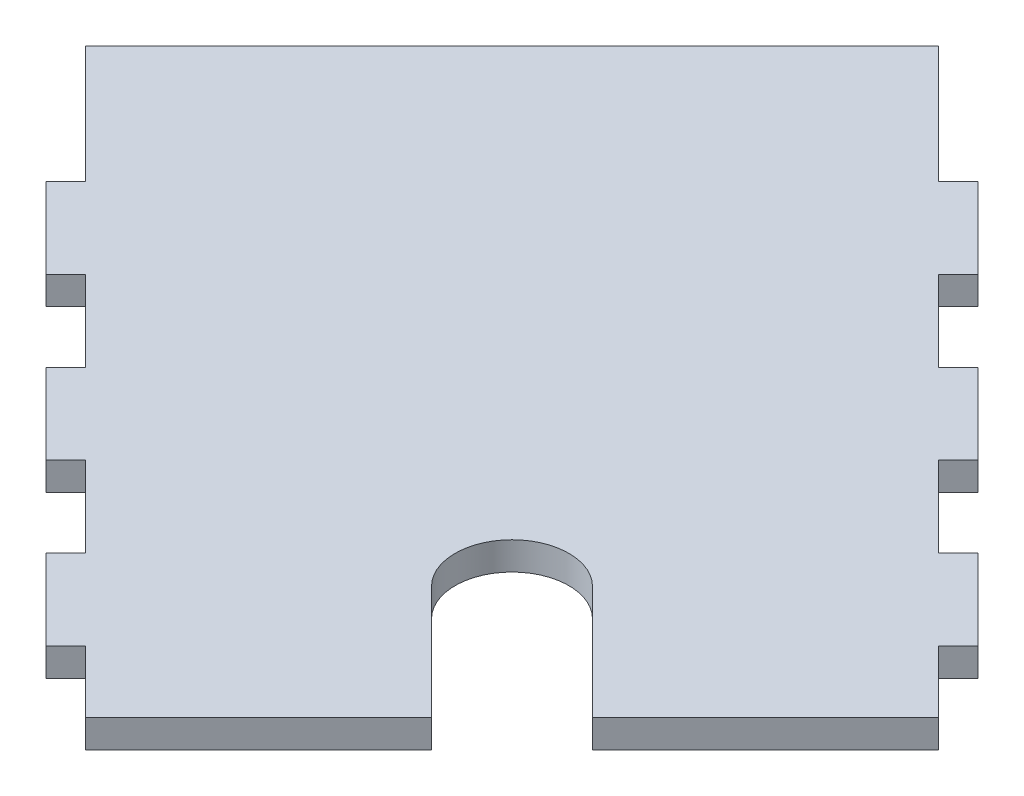
ISO-10303-21;
HEADER;
FILE_DESCRIPTION(('STEP AP214'),'2;1');
FILE_NAME('part.step','',(''),(''),'','','');
FILE_SCHEMA(('AUTOMOTIVE_DESIGN { 1 0 10303 214 1 1 1 1 }'));
ENDSEC;
DATA;
#1=APPLICATION_CONTEXT('core data for automotive mechanical design processes');
#2=APPLICATION_PROTOCOL_DEFINITION('international standard','automotive_design',2000,#1);
#3=PRODUCT_CONTEXT('',#1,'mechanical');
#4=PRODUCT('Part','Part','',(#3));
#5=PRODUCT_RELATED_PRODUCT_CATEGORY('part','',(#4));
#6=PRODUCT_DEFINITION_FORMATION('','',#4);
#7=PRODUCT_DEFINITION_CONTEXT('part definition',#1,'design');
#8=PRODUCT_DEFINITION('design','',#6,#7);
#9=PRODUCT_DEFINITION_SHAPE('','',#8);
#10=(LENGTH_UNIT() NAMED_UNIT(*) SI_UNIT(.MILLI.,.METRE.));
#11=(NAMED_UNIT(*) PLANE_ANGLE_UNIT() SI_UNIT($,.RADIAN.));
#12=(NAMED_UNIT(*) SI_UNIT($,.STERADIAN.) SOLID_ANGLE_UNIT());
#13=UNCERTAINTY_MEASURE_WITH_UNIT(LENGTH_MEASURE(1.E-05),#10,'distance_accuracy_value','');
#14=(GEOMETRIC_REPRESENTATION_CONTEXT(3) GLOBAL_UNCERTAINTY_ASSIGNED_CONTEXT((#13)) GLOBAL_UNIT_ASSIGNED_CONTEXT((#10,
#11,#12)) REPRESENTATION_CONTEXT('',''));
#15=CARTESIAN_POINT('',(0.,0.,0.));
#16=DIRECTION('',(0.,0.,1.));
#17=DIRECTION('',(1.,0.,0.));
#18=AXIS2_PLACEMENT_3D('',#15,#16,#17);
#19=CARTESIAN_POINT('',(146.127242634634,3.1242,-55.7134960817103));
#20=DIRECTION('',(-0.707106781186548,0.,0.707106781186548));
#21=DIRECTION('',(0.707106781186548,0.,0.707106781186548));
#22=AXIS2_PLACEMENT_3D('',#19,#20,#21);
#23=PLANE('',#22);
#24=DIRECTION('',(-0.707106781186547,0.,-0.707106781186547));
#25=VECTOR('',#24,1.);
#26=CARTESIAN_POINT('',(146.127242634634,0.,-55.7134960817103));
#27=LINE('',#26,#25);
#28=CARTESIAN_POINT('',(146.127242634634,0.,-55.7134960817103));
#29=VERTEX_POINT('',#28);
#30=CARTESIAN_POINT('',(139.212445421411,0.,-62.6282932949331));
#31=VERTEX_POINT('',#30);
#32=EDGE_CURVE('E273',#29,#31,#27,.T.);
#33=ORIENTED_EDGE('',*,*,#32,.T.);
#34=DIRECTION('',(0.,-1.,0.));
#35=VECTOR('',#34,1.);
#36=CARTESIAN_POINT('',(139.212445421411,3.1242,-62.6282932949331));
#37=LINE('',#36,#35);
#38=CARTESIAN_POINT('',(139.212445421411,3.1242,-62.6282932949331));
#39=VERTEX_POINT('',#38);
#40=EDGE_CURVE('E11',#39,#31,#37,.T.);
#41=ORIENTED_EDGE('',*,*,#40,.F.);
#42=DIRECTION('',(-0.707106781186547,0.,-0.707106781186547));
#43=VECTOR('',#42,1.);
#44=CARTESIAN_POINT('',(146.127242634634,3.1242,-55.7134960817103));
#45=LINE('',#44,#43);
#46=CARTESIAN_POINT('',(146.127242634634,3.1242,-55.7134960817103));
#47=VERTEX_POINT('',#46);
#48=EDGE_CURVE('E335',#47,#39,#45,.T.);
#49=ORIENTED_EDGE('',*,*,#48,.F.);
#50=DIRECTION('',(0.,-1.,0.));
#51=VECTOR('',#50,1.);
#52=CARTESIAN_POINT('',(146.127242634634,3.1242,-55.7134960817103));
#53=LINE('',#52,#51);
#54=EDGE_CURVE('E269',#47,#29,#53,.T.);
#55=ORIENTED_EDGE('',*,*,#54,.T.);
#56=EDGE_LOOP('',(#33,#41,#49,#55));
#57=FACE_BOUND('',#56,.T.);
#58=ADVANCED_FACE('F33',(#57),#23,.F.);
#59=CARTESIAN_POINT('',(139.212445421411,3.1242,-62.6282932949331));
#60=DIRECTION('',(-0.70710678118655,0.,-0.707106781186545));
#61=DIRECTION('',(-0.707106781186545,0.,0.70710678118655));
#62=AXIS2_PLACEMENT_3D('',#59,#60,#61);
#63=PLANE('',#62);
#64=DIRECTION('',(0.707106781186545,0.,-0.70710678118655));
#65=VECTOR('',#64,1.);
#66=CARTESIAN_POINT('',(139.212445421411,0.,-62.6282932949331));
#67=LINE('',#66,#65);
#68=CARTESIAN_POINT('',(141.421588427194,0.,-64.8374363007162));
#69=VERTEX_POINT('',#68);
#70=EDGE_CURVE('E276',#31,#69,#67,.T.);
#71=ORIENTED_EDGE('',*,*,#70,.T.);
#72=DIRECTION('',(0.,-1.,0.));
#73=VECTOR('',#72,1.);
#74=CARTESIAN_POINT('',(141.421588427194,3.1242,-64.8374363007162));
#75=LINE('',#74,#73);
#76=CARTESIAN_POINT('',(141.421588427194,3.1242,-64.8374363007162));
#77=VERTEX_POINT('',#76);
#78=EDGE_CURVE('E41',#77,#69,#75,.T.);
#79=ORIENTED_EDGE('',*,*,#78,.F.);
#80=DIRECTION('',(0.707106781186545,0.,-0.70710678118655));
#81=VECTOR('',#80,1.);
#82=CARTESIAN_POINT('',(139.212445421411,3.1242,-62.6282932949331));
#83=LINE('',#82,#81);
#84=EDGE_CURVE('E164',#39,#77,#83,.T.);
#85=ORIENTED_EDGE('',*,*,#84,.F.);
#86=ORIENTED_EDGE('',*,*,#40,.T.);
#87=EDGE_LOOP('',(#71,#79,#85,#86));
#88=FACE_BOUND('',#87,.T.);
#89=ADVANCED_FACE('F513',(#88),#63,.F.);
#90=CARTESIAN_POINT('',(141.421588427194,3.1242,-64.8374363007162));
#91=DIRECTION('',(-0.707106781186548,0.,0.707106781186548));
#92=DIRECTION('',(0.707106781186548,0.,0.707106781186548));
#93=AXIS2_PLACEMENT_3D('',#90,#91,#92);
#94=PLANE('',#93);
#95=DIRECTION('',(-0.707106781186547,0.,-0.707106781186547));
#96=VECTOR('',#95,1.);
#97=CARTESIAN_POINT('',(141.421588427194,0.,-64.8374363007162));
#98=LINE('',#97,#96);
#99=CARTESIAN_POINT('',(132.441332306125,0.,-73.8176924217853));
#100=VERTEX_POINT('',#99);
#101=EDGE_CURVE('E278',#69,#100,#98,.T.);
#102=ORIENTED_EDGE('',*,*,#101,.T.);
#103=DIRECTION('',(0.,-1.,0.));
#104=VECTOR('',#103,1.);
#105=CARTESIAN_POINT('',(132.441332306125,3.1242,-73.8176924217853));
#106=LINE('',#105,#104);
#107=CARTESIAN_POINT('',(132.441332306125,3.1242,-73.8176924217853));
#108=VERTEX_POINT('',#107);
#109=EDGE_CURVE('E414',#108,#100,#106,.T.);
#110=ORIENTED_EDGE('',*,*,#109,.F.);
#111=DIRECTION('',(-0.707106781186547,0.,-0.707106781186547));
#112=VECTOR('',#111,1.);
#113=CARTESIAN_POINT('',(141.421588427194,3.1242,-64.8374363007162));
#114=LINE('',#113,#112);
#115=EDGE_CURVE('E422',#77,#108,#114,.T.);
#116=ORIENTED_EDGE('',*,*,#115,.F.);
#117=ORIENTED_EDGE('',*,*,#78,.T.);
#118=EDGE_LOOP('',(#102,#110,#116,#117));
#119=FACE_BOUND('',#118,.T.);
#120=ADVANCED_FACE('F420',(#119),#94,.F.);
#121=CARTESIAN_POINT('',(132.441332306125,3.1242,-73.8176924217853));
#122=DIRECTION('',(0.707106781186548,0.,0.707106781186548));
#123=DIRECTION('',(0.707106781186548,0.,-0.707106781186548));
#124=AXIS2_PLACEMENT_3D('',#121,#122,#123);
#125=PLANE('',#124);
#126=DIRECTION('',(-0.707106781186547,0.,0.707106781186547));
#127=VECTOR('',#126,1.);
#128=CARTESIAN_POINT('',(132.441332306125,0.,-73.8176924217853));
#129=LINE('',#128,#127);
#130=CARTESIAN_POINT('',(130.232189300342,0.,-71.6085494160023));
#131=VERTEX_POINT('',#130);
#132=EDGE_CURVE('E280',#100,#131,#129,.T.);
#133=ORIENTED_EDGE('',*,*,#132,.T.);
#134=DIRECTION('',(0.,-1.,0.));
#135=VECTOR('',#134,1.);
#136=CARTESIAN_POINT('',(130.232189300342,3.1242,-71.6085494160023));
#137=LINE('',#136,#135);
#138=CARTESIAN_POINT('',(130.232189300342,3.1242,-71.6085494160023));
#139=VERTEX_POINT('',#138);
#140=EDGE_CURVE('E411',#139,#131,#137,.T.);
#141=ORIENTED_EDGE('',*,*,#140,.F.);
#142=DIRECTION('',(-0.707106781186547,0.,0.707106781186547));
#143=VECTOR('',#142,1.);
#144=CARTESIAN_POINT('',(132.441332306125,3.1242,-73.8176924217853));
#145=LINE('',#144,#143);
#146=EDGE_CURVE('E440',#108,#139,#145,.T.);
#147=ORIENTED_EDGE('',*,*,#146,.F.);
#148=ORIENTED_EDGE('',*,*,#109,.T.);
#149=EDGE_LOOP('',(#133,#141,#147,#148));
#150=FACE_BOUND('',#149,.T.);
#151=ADVANCED_FACE('F431',(#150),#125,.F.);
#152=CARTESIAN_POINT('',(130.232189300342,3.1242,-71.6085494160023));
#153=DIRECTION('',(-0.707106781186549,0.,0.707106781186546));
#154=DIRECTION('',(0.707106781186546,0.,0.707106781186549));
#155=AXIS2_PLACEMENT_3D('',#152,#153,#154);
#156=PLANE('',#155);
#157=DIRECTION('',(-0.707106781186546,0.,-0.707106781186549));
#158=VECTOR('',#157,1.);
#159=CARTESIAN_POINT('',(130.232189300342,0.,-71.6085494160023));
#160=LINE('',#159,#158);
#161=CARTESIAN_POINT('',(121.251933179273,0.,-80.5888055370715));
#162=VERTEX_POINT('',#161);
#163=EDGE_CURVE('E282',#131,#162,#160,.T.);
#164=ORIENTED_EDGE('',*,*,#163,.T.);
#165=DIRECTION('',(0.,-1.,0.));
#166=VECTOR('',#165,1.);
#167=CARTESIAN_POINT('',(121.251933179273,3.1242,-80.5888055370715));
#168=LINE('',#167,#166);
#169=CARTESIAN_POINT('',(121.251933179273,3.1242,-80.5888055370715));
#170=VERTEX_POINT('',#169);
#171=EDGE_CURVE('E408',#170,#162,#168,.T.);
#172=ORIENTED_EDGE('',*,*,#171,.F.);
#173=DIRECTION('',(-0.707106781186546,0.,-0.707106781186549));
#174=VECTOR('',#173,1.);
#175=CARTESIAN_POINT('',(130.232189300342,3.1242,-71.6085494160023));
#176=LINE('',#175,#174);
#177=EDGE_CURVE('E437',#139,#170,#176,.T.);
#178=ORIENTED_EDGE('',*,*,#177,.F.);
#179=ORIENTED_EDGE('',*,*,#140,.T.);
#180=EDGE_LOOP('',(#164,#172,#178,#179));
#181=FACE_BOUND('',#180,.T.);
#182=ADVANCED_FACE('F435',(#181),#156,.F.);
#183=CARTESIAN_POINT('',(121.251933179273,3.1242,-80.5888055370715));
#184=DIRECTION('',(-0.707106781186552,0.,-0.707106781186543));
#185=DIRECTION('',(-0.707106781186543,0.,0.707106781186552));
#186=AXIS2_PLACEMENT_3D('',#183,#184,#185);
#187=PLANE('',#186);
#188=DIRECTION('',(0.707106781186543,0.,-0.707106781186552));
#189=VECTOR('',#188,1.);
#190=CARTESIAN_POINT('',(121.251933179273,0.,-80.5888055370715));
#191=LINE('',#190,#189);
#192=CARTESIAN_POINT('',(123.461076185056,0.,-82.7979485428545));
#193=VERTEX_POINT('',#192);
#194=EDGE_CURVE('E284',#162,#193,#191,.T.);
#195=ORIENTED_EDGE('',*,*,#194,.T.);
#196=DIRECTION('',(0.,-1.,0.));
#197=VECTOR('',#196,1.);
#198=CARTESIAN_POINT('',(123.461076185056,3.1242,-82.7979485428545));
#199=LINE('',#198,#197);
#200=CARTESIAN_POINT('',(123.461076185056,3.1242,-82.7979485428545));
#201=VERTEX_POINT('',#200);
#202=EDGE_CURVE('E405',#201,#193,#199,.T.);
#203=ORIENTED_EDGE('',*,*,#202,.F.);
#204=DIRECTION('',(0.707106781186543,0.,-0.707106781186552));
#205=VECTOR('',#204,1.);
#206=CARTESIAN_POINT('',(121.251933179273,3.1242,-80.5888055370715));
#207=LINE('',#206,#205);
#208=EDGE_CURVE('E439',#170,#201,#207,.T.);
#209=ORIENTED_EDGE('',*,*,#208,.F.);
#210=ORIENTED_EDGE('',*,*,#171,.T.);
#211=EDGE_LOOP('',(#195,#203,#209,#210));
#212=FACE_BOUND('',#211,.T.);
#213=ADVANCED_FACE('F526',(#212),#187,.F.);
#214=CARTESIAN_POINT('',(123.461076185056,3.1242,-82.7979485428545));
#215=DIRECTION('',(-0.707106781186548,0.,0.707106781186548));
#216=DIRECTION('',(0.707106781186548,0.,0.707106781186548));
#217=AXIS2_PLACEMENT_3D('',#214,#215,#216);
#218=PLANE('',#217);
#219=DIRECTION('',(-0.707106781186547,0.,-0.707106781186547));
#220=VECTOR('',#219,1.);
#221=CARTESIAN_POINT('',(123.461076185056,0.,-82.7979485428545));
#222=LINE('',#221,#220);
#223=CARTESIAN_POINT('',(114.480820063987,0.,-91.7782046639236));
#224=VERTEX_POINT('',#223);
#225=EDGE_CURVE('E286',#193,#224,#222,.T.);
#226=ORIENTED_EDGE('',*,*,#225,.T.);
#227=DIRECTION('',(0.,-1.,0.));
#228=VECTOR('',#227,1.);
#229=CARTESIAN_POINT('',(114.480820063987,3.1242,-91.7782046639236));
#230=LINE('',#229,#228);
#231=CARTESIAN_POINT('',(114.480820063987,3.1242,-91.7782046639236));
#232=VERTEX_POINT('',#231);
#233=EDGE_CURVE('E402',#232,#224,#230,.T.);
#234=ORIENTED_EDGE('',*,*,#233,.F.);
#235=DIRECTION('',(-0.707106781186547,0.,-0.707106781186547));
#236=VECTOR('',#235,1.);
#237=CARTESIAN_POINT('',(123.461076185056,3.1242,-82.7979485428545));
#238=LINE('',#237,#236);
#239=EDGE_CURVE('E442',#201,#232,#238,.T.);
#240=ORIENTED_EDGE('',*,*,#239,.F.);
#241=ORIENTED_EDGE('',*,*,#202,.T.);
#242=EDGE_LOOP('',(#226,#234,#240,#241));
#243=FACE_BOUND('',#242,.T.);
#244=ADVANCED_FACE('F529',(#243),#218,.F.);
#245=CARTESIAN_POINT('',(114.480820063987,3.1242,-91.7782046639236));
#246=DIRECTION('',(0.707106781186548,0.,0.707106781186548));
#247=DIRECTION('',(0.707106781186548,0.,-0.707106781186548));
#248=AXIS2_PLACEMENT_3D('',#245,#246,#247);
#249=PLANE('',#248);
#250=DIRECTION('',(-0.707106781186547,0.,0.707106781186547));
#251=VECTOR('',#250,1.);
#252=CARTESIAN_POINT('',(114.480820063987,0.,-91.7782046639236));
#253=LINE('',#252,#251);
#254=CARTESIAN_POINT('',(112.271677058204,0.,-89.5690616581406));
#255=VERTEX_POINT('',#254);
#256=EDGE_CURVE('E288',#224,#255,#253,.T.);
#257=ORIENTED_EDGE('',*,*,#256,.T.);
#258=DIRECTION('',(0.,-1.,0.));
#259=VECTOR('',#258,1.);
#260=CARTESIAN_POINT('',(112.271677058204,3.1242,-89.5690616581406));
#261=LINE('',#260,#259);
#262=CARTESIAN_POINT('',(112.271677058204,3.1242,-89.5690616581406));
#263=VERTEX_POINT('',#262);
#264=EDGE_CURVE('E399',#263,#255,#261,.T.);
#265=ORIENTED_EDGE('',*,*,#264,.F.);
#266=DIRECTION('',(-0.707106781186547,0.,0.707106781186547));
#267=VECTOR('',#266,1.);
#268=CARTESIAN_POINT('',(114.480820063987,3.1242,-91.7782046639236));
#269=LINE('',#268,#267);
#270=EDGE_CURVE('E448',#232,#263,#269,.T.);
#271=ORIENTED_EDGE('',*,*,#270,.F.);
#272=ORIENTED_EDGE('',*,*,#233,.T.);
#273=EDGE_LOOP('',(#257,#265,#271,#272));
#274=FACE_BOUND('',#273,.T.);
#275=ADVANCED_FACE('F533',(#274),#249,.F.);
#276=CARTESIAN_POINT('',(112.271677058204,3.1242,-89.5690616581406));
#277=DIRECTION('',(-0.707106781186549,0.,0.707106781186546));
#278=DIRECTION('',(0.707106781186546,0.,0.707106781186549));
#279=AXIS2_PLACEMENT_3D('',#276,#277,#278);
#280=PLANE('',#279);
#281=DIRECTION('',(-0.707106781186546,0.,-0.707106781186549));
#282=VECTOR('',#281,1.);
#283=CARTESIAN_POINT('',(112.271677058204,0.,-89.5690616581406));
#284=LINE('',#283,#282);
#285=CARTESIAN_POINT('',(103.291420937135,0.,-98.5493177792098));
#286=VERTEX_POINT('',#285);
#287=EDGE_CURVE('E290',#255,#286,#284,.T.);
#288=ORIENTED_EDGE('',*,*,#287,.T.);
#289=DIRECTION('',(0.,-1.,0.));
#290=VECTOR('',#289,1.);
#291=CARTESIAN_POINT('',(103.291420937135,3.1242,-98.5493177792098));
#292=LINE('',#291,#290);
#293=CARTESIAN_POINT('',(103.291420937135,3.1242,-98.5493177792098));
#294=VERTEX_POINT('',#293);
#295=EDGE_CURVE('E396',#294,#286,#292,.T.);
#296=ORIENTED_EDGE('',*,*,#295,.F.);
#297=DIRECTION('',(-0.707106781186546,0.,-0.707106781186549));
#298=VECTOR('',#297,1.);
#299=CARTESIAN_POINT('',(112.271677058204,3.1242,-89.5690616581406));
#300=LINE('',#299,#298);
#301=EDGE_CURVE('E450',#263,#294,#300,.T.);
#302=ORIENTED_EDGE('',*,*,#301,.F.);
#303=ORIENTED_EDGE('',*,*,#264,.T.);
#304=EDGE_LOOP('',(#288,#296,#302,#303));
#305=FACE_BOUND('',#304,.T.);
#306=ADVANCED_FACE('F537',(#305),#280,.F.);
#307=CARTESIAN_POINT('',(103.291420937135,3.1242,-98.5493177792098));
#308=DIRECTION('',(-0.70710678118655,0.,-0.707106781186545));
#309=DIRECTION('',(-0.707106781186545,0.,0.70710678118655));
#310=AXIS2_PLACEMENT_3D('',#307,#308,#309);
#311=PLANE('',#310);
#312=DIRECTION('',(0.707106781186545,0.,-0.70710678118655));
#313=VECTOR('',#312,1.);
#314=CARTESIAN_POINT('',(103.291420937135,0.,-98.5493177792098));
#315=LINE('',#314,#313);
#316=CARTESIAN_POINT('',(105.500563942918,0.,-100.758460784993));
#317=VERTEX_POINT('',#316);
#318=EDGE_CURVE('E292',#286,#317,#315,.T.);
#319=ORIENTED_EDGE('',*,*,#318,.T.);
#320=DIRECTION('',(0.,-1.,0.));
#321=VECTOR('',#320,1.);
#322=CARTESIAN_POINT('',(105.500563942918,3.1242,-100.758460784993));
#323=LINE('',#322,#321);
#324=CARTESIAN_POINT('',(105.500563942918,3.1242,-100.758460784993));
#325=VERTEX_POINT('',#324);
#326=EDGE_CURVE('E393',#325,#317,#323,.T.);
#327=ORIENTED_EDGE('',*,*,#326,.F.);
#328=DIRECTION('',(0.707106781186545,0.,-0.70710678118655));
#329=VECTOR('',#328,1.);
#330=CARTESIAN_POINT('',(103.291420937135,3.1242,-98.5493177792098));
#331=LINE('',#330,#329);
#332=EDGE_CURVE('E452',#294,#325,#331,.T.);
#333=ORIENTED_EDGE('',*,*,#332,.F.);
#334=ORIENTED_EDGE('',*,*,#295,.T.);
#335=EDGE_LOOP('',(#319,#327,#333,#334));
#336=FACE_BOUND('',#335,.T.);
#337=ADVANCED_FACE('F541',(#336),#311,.F.);
#338=CARTESIAN_POINT('',(105.500563942918,3.1242,-100.758460784993));
#339=DIRECTION('',(-0.707106781186548,0.,0.707106781186548));
#340=DIRECTION('',(0.707106781186548,0.,0.707106781186548));
#341=AXIS2_PLACEMENT_3D('',#338,#339,#340);
#342=PLANE('',#341);
#343=DIRECTION('',(-0.707106781186547,0.,-0.707106781186547));
#344=VECTOR('',#343,1.);
#345=CARTESIAN_POINT('',(105.500563942918,0.,-100.758460784993));
#346=LINE('',#345,#344);
#347=CARTESIAN_POINT('',(96.5203078218484,0.,-109.738716906062));
#348=VERTEX_POINT('',#347);
#349=EDGE_CURVE('E294',#317,#348,#346,.T.);
#350=ORIENTED_EDGE('',*,*,#349,.T.);
#351=DIRECTION('',(0.,-1.,0.));
#352=VECTOR('',#351,1.);
#353=CARTESIAN_POINT('',(96.5203078218484,3.1242,-109.738716906062));
#354=LINE('',#353,#352);
#355=CARTESIAN_POINT('',(96.5203078218484,3.1242,-109.738716906062));
#356=VERTEX_POINT('',#355);
#357=EDGE_CURVE('E390',#356,#348,#354,.T.);
#358=ORIENTED_EDGE('',*,*,#357,.F.);
#359=DIRECTION('',(-0.707106781186547,0.,-0.707106781186547));
#360=VECTOR('',#359,1.);
#361=CARTESIAN_POINT('',(105.500563942918,3.1242,-100.758460784993));
#362=LINE('',#361,#360);
#363=EDGE_CURVE('E454',#325,#356,#362,.T.);
#364=ORIENTED_EDGE('',*,*,#363,.F.);
#365=ORIENTED_EDGE('',*,*,#326,.T.);
#366=EDGE_LOOP('',(#350,#358,#364,#365));
#367=FACE_BOUND('',#366,.T.);
#368=ADVANCED_FACE('F545',(#367),#342,.F.);
#369=CARTESIAN_POINT('',(96.5203078218484,3.1242,-109.738716906062));
#370=DIRECTION('',(0.707106781186547,0.,0.707106781186547));
#371=DIRECTION('',(0.707106781186548,0.,-0.707106781186548));
#372=AXIS2_PLACEMENT_3D('',#369,#370,#371);
#373=PLANE('',#372);
#374=DIRECTION('',(-0.707106781186548,0.,0.707106781186548));
#375=VECTOR('',#374,1.);
#376=CARTESIAN_POINT('',(96.5203078218484,0.,-109.738716906062));
#377=LINE('',#376,#375);
#378=CARTESIAN_POINT('',(94.3111648160654,0.,-107.529573900279));
#379=VERTEX_POINT('',#378);
#380=EDGE_CURVE('E296',#348,#379,#377,.T.);
#381=ORIENTED_EDGE('',*,*,#380,.T.);
#382=DIRECTION('',(0.,-1.,0.));
#383=VECTOR('',#382,1.);
#384=CARTESIAN_POINT('',(94.3111648160654,3.1242,-107.529573900279));
#385=LINE('',#384,#383);
#386=CARTESIAN_POINT('',(94.3111648160654,3.1242,-107.529573900279));
#387=VERTEX_POINT('',#386);
#388=EDGE_CURVE('E387',#387,#379,#385,.T.);
#389=ORIENTED_EDGE('',*,*,#388,.F.);
#390=DIRECTION('',(-0.707106781186548,0.,0.707106781186548));
#391=VECTOR('',#390,1.);
#392=CARTESIAN_POINT('',(96.5203078218484,3.1242,-109.738716906062));
#393=LINE('',#392,#391);
#394=EDGE_CURVE('E456',#356,#387,#393,.T.);
#395=ORIENTED_EDGE('',*,*,#394,.F.);
#396=ORIENTED_EDGE('',*,*,#357,.T.);
#397=EDGE_LOOP('',(#381,#389,#395,#396));
#398=FACE_BOUND('',#397,.T.);
#399=ADVANCED_FACE('F549',(#398),#373,.F.);
#400=CARTESIAN_POINT('',(94.3111648160654,3.1242,-107.529573900279));
#401=DIRECTION('',(-0.707106781186547,0.,0.707106781186548));
#402=DIRECTION('',(0.707106781186548,0.,0.707106781186547));
#403=AXIS2_PLACEMENT_3D('',#400,#401,#402);
#404=PLANE('',#403);
#405=DIRECTION('',(-0.707106781186548,0.,-0.707106781186547));
#406=VECTOR('',#405,1.);
#407=CARTESIAN_POINT('',(94.3111648160654,0.,-107.529573900279));
#408=LINE('',#407,#406);
#409=CARTESIAN_POINT('',(81.2250949148757,0.,-120.615643801469));
#410=VERTEX_POINT('',#409);
#411=EDGE_CURVE('E298',#379,#410,#408,.T.);
#412=ORIENTED_EDGE('',*,*,#411,.T.);
#413=DIRECTION('',(0.,-1.,0.));
#414=VECTOR('',#413,1.);
#415=CARTESIAN_POINT('',(81.2250949148757,3.1242,-120.615643801469));
#416=LINE('',#415,#414);
#417=CARTESIAN_POINT('',(81.2250949148757,3.1242,-120.615643801469));
#418=VERTEX_POINT('',#417);
#419=EDGE_CURVE('E384',#418,#410,#416,.T.);
#420=ORIENTED_EDGE('',*,*,#419,.F.);
#421=DIRECTION('',(-0.707106781186548,0.,-0.707106781186547));
#422=VECTOR('',#421,1.);
#423=CARTESIAN_POINT('',(94.3111648160654,3.1242,-107.529573900279));
#424=LINE('',#423,#422);
#425=EDGE_CURVE('E458',#387,#418,#424,.T.);
#426=ORIENTED_EDGE('',*,*,#425,.F.);
#427=ORIENTED_EDGE('',*,*,#388,.T.);
#428=EDGE_LOOP('',(#412,#420,#426,#427));
#429=FACE_BOUND('',#428,.T.);
#430=ADVANCED_FACE('F553',(#429),#404,.F.);
#431=CARTESIAN_POINT('',(81.2250949148757,3.1242,-120.615643801469));
#432=DIRECTION('',(0.707106781186548,0.,0.707106781186547));
#433=DIRECTION('',(0.707106781186547,0.,-0.707106781186548));
#434=AXIS2_PLACEMENT_3D('',#431,#432,#433);
#435=PLANE('',#434);
#436=DIRECTION('',(-0.707106781186547,0.,0.707106781186548));
#437=VECTOR('',#436,1.);
#438=CARTESIAN_POINT('',(81.2250949148757,0.,-120.615643801469));
#439=LINE('',#438,#437);
#440=CARTESIAN_POINT('',(33.6297374732092,0.,-73.0202863598022));
#441=VERTEX_POINT('',#440);
#442=EDGE_CURVE('E300',#410,#441,#439,.T.);
#443=ORIENTED_EDGE('',*,*,#442,.T.);
#444=DIRECTION('',(0.,-1.,0.));
#445=VECTOR('',#444,1.);
#446=CARTESIAN_POINT('',(33.6297374732092,3.1242,-73.0202863598022));
#447=LINE('',#446,#445);
#448=CARTESIAN_POINT('',(33.6297374732092,3.1242,-73.0202863598022));
#449=VERTEX_POINT('',#448);
#450=EDGE_CURVE('E381',#449,#441,#447,.T.);
#451=ORIENTED_EDGE('',*,*,#450,.F.);
#452=DIRECTION('',(-0.707106781186547,0.,0.707106781186548));
#453=VECTOR('',#452,1.);
#454=CARTESIAN_POINT('',(81.2250949148757,3.1242,-120.615643801469));
#455=LINE('',#454,#453);
#456=EDGE_CURVE('E460',#418,#449,#455,.T.);
#457=ORIENTED_EDGE('',*,*,#456,.F.);
#458=ORIENTED_EDGE('',*,*,#419,.T.);
#459=EDGE_LOOP('',(#443,#451,#457,#458));
#460=FACE_BOUND('',#459,.T.);
#461=ADVANCED_FACE('F557',(#460),#435,.F.);
#462=CARTESIAN_POINT('',(33.6297374732092,3.1242,-73.0202863598022));
#463=DIRECTION('',(0.707106781186547,0.,-0.707106781186548));
#464=DIRECTION('',(-0.707106781186548,0.,-0.707106781186547));
#465=AXIS2_PLACEMENT_3D('',#462,#463,#464);
#466=PLANE('',#465);
#467=DIRECTION('',(0.707106781186548,0.,0.707106781186547));
#468=VECTOR('',#467,1.);
#469=CARTESIAN_POINT('',(33.6297374732092,0.,-73.0202863598022));
#470=LINE('',#469,#468);
#471=CARTESIAN_POINT('',(46.7158073743989,0.,-59.9342164586124));
#472=VERTEX_POINT('',#471);
#473=EDGE_CURVE('E302',#441,#472,#470,.T.);
#474=ORIENTED_EDGE('',*,*,#473,.T.);
#475=DIRECTION('',(0.,-1.,0.));
#476=VECTOR('',#475,1.);
#477=CARTESIAN_POINT('',(46.7158073743989,3.1242,-59.9342164586124));
#478=LINE('',#477,#476);
#479=CARTESIAN_POINT('',(46.7158073743989,3.1242,-59.9342164586124));
#480=VERTEX_POINT('',#479);
#481=EDGE_CURVE('E378',#480,#472,#478,.T.);
#482=ORIENTED_EDGE('',*,*,#481,.F.);
#483=DIRECTION('',(0.707106781186548,0.,0.707106781186547));
#484=VECTOR('',#483,1.);
#485=CARTESIAN_POINT('',(33.6297374732092,3.1242,-73.0202863598022));
#486=LINE('',#485,#484);
#487=EDGE_CURVE('E462',#449,#480,#486,.T.);
#488=ORIENTED_EDGE('',*,*,#487,.F.);
#489=ORIENTED_EDGE('',*,*,#450,.T.);
#490=EDGE_LOOP('',(#474,#482,#488,#489));
#491=FACE_BOUND('',#490,.T.);
#492=ADVANCED_FACE('F561',(#491),#466,.F.);
#493=CARTESIAN_POINT('',(46.7158073743989,3.1242,-59.9342164586124));
#494=DIRECTION('',(0.707106781186547,0.,0.707106781186547));
#495=DIRECTION('',(0.707106781186548,0.,-0.707106781186548));
#496=AXIS2_PLACEMENT_3D('',#493,#494,#495);
#497=PLANE('',#496);
#498=DIRECTION('',(-0.707106781186548,0.,0.707106781186548));
#499=VECTOR('',#498,1.);
#500=CARTESIAN_POINT('',(46.7158073743989,0.,-59.9342164586124));
#501=LINE('',#500,#499);
#502=CARTESIAN_POINT('',(44.5066643686159,0.,-57.7250734528294));
#503=VERTEX_POINT('',#502);
#504=EDGE_CURVE('E304',#472,#503,#501,.T.);
#505=ORIENTED_EDGE('',*,*,#504,.T.);
#506=DIRECTION('',(0.,-1.,0.));
#507=VECTOR('',#506,1.);
#508=CARTESIAN_POINT('',(44.5066643686159,3.1242,-57.7250734528294));
#509=LINE('',#508,#507);
#510=CARTESIAN_POINT('',(44.5066643686159,3.1242,-57.7250734528294));
#511=VERTEX_POINT('',#510);
#512=EDGE_CURVE('E375',#511,#503,#509,.T.);
#513=ORIENTED_EDGE('',*,*,#512,.F.);
#514=DIRECTION('',(-0.707106781186548,0.,0.707106781186548));
#515=VECTOR('',#514,1.);
#516=CARTESIAN_POINT('',(46.7158073743989,3.1242,-59.9342164586124));
#517=LINE('',#516,#515);
#518=EDGE_CURVE('E464',#480,#511,#517,.T.);
#519=ORIENTED_EDGE('',*,*,#518,.F.);
#520=ORIENTED_EDGE('',*,*,#481,.T.);
#521=EDGE_LOOP('',(#505,#513,#519,#520));
#522=FACE_BOUND('',#521,.T.);
#523=ADVANCED_FACE('F565',(#522),#497,.F.);
#524=CARTESIAN_POINT('',(44.5066643686159,3.1242,-57.7250734528294));
#525=DIRECTION('',(0.707106781186547,0.,-0.707106781186547));
#526=DIRECTION('',(-0.707106781186548,0.,-0.707106781186548));
#527=AXIS2_PLACEMENT_3D('',#524,#525,#526);
#528=PLANE('',#527);
#529=DIRECTION('',(0.707106781186548,0.,0.707106781186548));
#530=VECTOR('',#529,1.);
#531=CARTESIAN_POINT('',(44.5066643686159,0.,-57.7250734528294));
#532=LINE('',#531,#530);
#533=CARTESIAN_POINT('',(53.4869204896851,0.,-48.7448173317602));
#534=VERTEX_POINT('',#533);
#535=EDGE_CURVE('E306',#503,#534,#532,.T.);
#536=ORIENTED_EDGE('',*,*,#535,.T.);
#537=DIRECTION('',(0.,-1.,0.));
#538=VECTOR('',#537,1.);
#539=CARTESIAN_POINT('',(53.4869204896851,3.1242,-48.7448173317602));
#540=LINE('',#539,#538);
#541=CARTESIAN_POINT('',(53.4869204896851,3.1242,-48.7448173317602));
#542=VERTEX_POINT('',#541);
#543=EDGE_CURVE('E372',#542,#534,#540,.T.);
#544=ORIENTED_EDGE('',*,*,#543,.F.);
#545=DIRECTION('',(0.707106781186548,0.,0.707106781186548));
#546=VECTOR('',#545,1.);
#547=CARTESIAN_POINT('',(44.5066643686159,3.1242,-57.7250734528294));
#548=LINE('',#547,#546);
#549=EDGE_CURVE('E466',#511,#542,#548,.T.);
#550=ORIENTED_EDGE('',*,*,#549,.F.);
#551=ORIENTED_EDGE('',*,*,#512,.T.);
#552=EDGE_LOOP('',(#536,#544,#550,#551));
#553=FACE_BOUND('',#552,.T.);
#554=ADVANCED_FACE('F569',(#553),#528,.F.);
#555=CARTESIAN_POINT('',(53.4869204896851,3.1242,-48.7448173317602));
#556=DIRECTION('',(-0.707106781186547,0.,-0.707106781186547));
#557=DIRECTION('',(-0.707106781186548,0.,0.707106781186548));
#558=AXIS2_PLACEMENT_3D('',#555,#556,#557);
#559=PLANE('',#558);
#560=DIRECTION('',(0.707106781186548,0.,-0.707106781186548));
#561=VECTOR('',#560,1.);
#562=CARTESIAN_POINT('',(53.4869204896851,0.,-48.7448173317602));
#563=LINE('',#562,#561);
#564=CARTESIAN_POINT('',(55.6960634954681,0.,-50.9539603375432));
#565=VERTEX_POINT('',#564);
#566=EDGE_CURVE('E308',#534,#565,#563,.T.);
#567=ORIENTED_EDGE('',*,*,#566,.T.);
#568=DIRECTION('',(0.,-1.,0.));
#569=VECTOR('',#568,1.);
#570=CARTESIAN_POINT('',(55.6960634954681,3.1242,-50.9539603375432));
#571=LINE('',#570,#569);
#572=CARTESIAN_POINT('',(55.6960634954681,3.1242,-50.9539603375432));
#573=VERTEX_POINT('',#572);
#574=EDGE_CURVE('E369',#573,#565,#571,.T.);
#575=ORIENTED_EDGE('',*,*,#574,.F.);
#576=DIRECTION('',(0.707106781186548,0.,-0.707106781186548));
#577=VECTOR('',#576,1.);
#578=CARTESIAN_POINT('',(53.4869204896851,3.1242,-48.7448173317602));
#579=LINE('',#578,#577);
#580=EDGE_CURVE('E468',#542,#573,#579,.T.);
#581=ORIENTED_EDGE('',*,*,#580,.F.);
#582=ORIENTED_EDGE('',*,*,#543,.T.);
#583=EDGE_LOOP('',(#567,#575,#581,#582));
#584=FACE_BOUND('',#583,.T.);
#585=ADVANCED_FACE('F573',(#584),#559,.F.);
#586=CARTESIAN_POINT('',(55.6960634954681,3.1242,-50.9539603375432));
#587=DIRECTION('',(0.707106781186546,0.,-0.707106781186549));
#588=DIRECTION('',(-0.707106781186549,0.,-0.707106781186546));
#589=AXIS2_PLACEMENT_3D('',#586,#587,#588);
#590=PLANE('',#589);
#591=DIRECTION('',(0.707106781186549,0.,0.707106781186546));
#592=VECTOR('',#591,1.);
#593=CARTESIAN_POINT('',(55.6960634954681,0.,-50.9539603375432));
#594=LINE('',#593,#592);
#595=CARTESIAN_POINT('',(64.6763196165373,0.,-41.9737042164741));
#596=VERTEX_POINT('',#595);
#597=EDGE_CURVE('E310',#565,#596,#594,.T.);
#598=ORIENTED_EDGE('',*,*,#597,.T.);
#599=DIRECTION('',(0.,-1.,0.));
#600=VECTOR('',#599,1.);
#601=CARTESIAN_POINT('',(64.6763196165373,3.1242,-41.9737042164741));
#602=LINE('',#601,#600);
#603=CARTESIAN_POINT('',(64.6763196165373,3.1242,-41.9737042164741));
#604=VERTEX_POINT('',#603);
#605=EDGE_CURVE('E366',#604,#596,#602,.T.);
#606=ORIENTED_EDGE('',*,*,#605,.F.);
#607=DIRECTION('',(0.707106781186549,0.,0.707106781186546));
#608=VECTOR('',#607,1.);
#609=CARTESIAN_POINT('',(55.6960634954681,3.1242,-50.9539603375432));
#610=LINE('',#609,#608);
#611=EDGE_CURVE('E470',#573,#604,#610,.T.);
#612=ORIENTED_EDGE('',*,*,#611,.F.);
#613=ORIENTED_EDGE('',*,*,#574,.T.);
#614=EDGE_LOOP('',(#598,#606,#612,#613));
#615=FACE_BOUND('',#614,.T.);
#616=ADVANCED_FACE('F577',(#615),#590,.F.);
#617=CARTESIAN_POINT('',(64.6763196165373,3.1242,-41.9737042164741));
#618=DIRECTION('',(0.707106781186548,0.,0.707106781186548));
#619=DIRECTION('',(0.707106781186548,0.,-0.707106781186548));
#620=AXIS2_PLACEMENT_3D('',#617,#618,#619);
#621=PLANE('',#620);
#622=DIRECTION('',(-0.707106781186547,0.,0.707106781186547));
#623=VECTOR('',#622,1.);
#624=CARTESIAN_POINT('',(64.6763196165373,0.,-41.9737042164741));
#625=LINE('',#624,#623);
#626=CARTESIAN_POINT('',(62.4671766107542,0.,-39.7645612106911));
#627=VERTEX_POINT('',#626);
#628=EDGE_CURVE('E312',#596,#627,#625,.T.);
#629=ORIENTED_EDGE('',*,*,#628,.T.);
#630=DIRECTION('',(0.,-1.,0.));
#631=VECTOR('',#630,1.);
#632=CARTESIAN_POINT('',(62.4671766107542,3.1242,-39.7645612106911));
#633=LINE('',#632,#631);
#634=CARTESIAN_POINT('',(62.4671766107542,3.1242,-39.7645612106911));
#635=VERTEX_POINT('',#634);
#636=EDGE_CURVE('E363',#635,#627,#633,.T.);
#637=ORIENTED_EDGE('',*,*,#636,.F.);
#638=DIRECTION('',(-0.707106781186547,0.,0.707106781186547));
#639=VECTOR('',#638,1.);
#640=CARTESIAN_POINT('',(64.6763196165373,3.1242,-41.9737042164741));
#641=LINE('',#640,#639);
#642=EDGE_CURVE('E472',#604,#635,#641,.T.);
#643=ORIENTED_EDGE('',*,*,#642,.F.);
#644=ORIENTED_EDGE('',*,*,#605,.T.);
#645=EDGE_LOOP('',(#629,#637,#643,#644));
#646=FACE_BOUND('',#645,.T.);
#647=ADVANCED_FACE('F581',(#646),#621,.F.);
#648=CARTESIAN_POINT('',(62.4671766107542,3.1242,-39.7645612106911));
#649=DIRECTION('',(0.707106781186547,0.,-0.707106781186548));
#650=DIRECTION('',(-0.707106781186548,0.,-0.707106781186547));
#651=AXIS2_PLACEMENT_3D('',#648,#649,#650);
#652=PLANE('',#651);
#653=DIRECTION('',(0.707106781186548,0.,0.707106781186547));
#654=VECTOR('',#653,1.);
#655=CARTESIAN_POINT('',(62.4671766107542,0.,-39.7645612106911));
#656=LINE('',#655,#654);
#657=CARTESIAN_POINT('',(71.4474327318234,0.,-30.7843050896219));
#658=VERTEX_POINT('',#657);
#659=EDGE_CURVE('E314',#627,#658,#656,.T.);
#660=ORIENTED_EDGE('',*,*,#659,.T.);
#661=DIRECTION('',(0.,-1.,0.));
#662=VECTOR('',#661,1.);
#663=CARTESIAN_POINT('',(71.4474327318234,3.1242,-30.7843050896219));
#664=LINE('',#663,#662);
#665=CARTESIAN_POINT('',(71.4474327318234,3.1242,-30.7843050896219));
#666=VERTEX_POINT('',#665);
#667=EDGE_CURVE('E360',#666,#658,#664,.T.);
#668=ORIENTED_EDGE('',*,*,#667,.F.);
#669=DIRECTION('',(0.707106781186548,0.,0.707106781186547));
#670=VECTOR('',#669,1.);
#671=CARTESIAN_POINT('',(62.4671766107542,3.1242,-39.7645612106911));
#672=LINE('',#671,#670);
#673=EDGE_CURVE('E474',#635,#666,#672,.T.);
#674=ORIENTED_EDGE('',*,*,#673,.F.);
#675=ORIENTED_EDGE('',*,*,#636,.T.);
#676=EDGE_LOOP('',(#660,#668,#674,#675));
#677=FACE_BOUND('',#676,.T.);
#678=ADVANCED_FACE('F585',(#677),#652,.F.);
#679=CARTESIAN_POINT('',(71.4474327318234,3.1242,-30.7843050896219));
#680=DIRECTION('',(-0.707106781186545,0.,-0.70710678118655));
#681=DIRECTION('',(-0.70710678118655,0.,0.707106781186545));
#682=AXIS2_PLACEMENT_3D('',#679,#680,#681);
#683=PLANE('',#682);
#684=DIRECTION('',(0.70710678118655,0.,-0.707106781186545));
#685=VECTOR('',#684,1.);
#686=CARTESIAN_POINT('',(71.4474327318234,0.,-30.7843050896219));
#687=LINE('',#686,#685);
#688=CARTESIAN_POINT('',(73.6565757376064,0.,-32.9934480954049));
#689=VERTEX_POINT('',#688);
#690=EDGE_CURVE('E316',#658,#689,#687,.T.);
#691=ORIENTED_EDGE('',*,*,#690,.T.);
#692=DIRECTION('',(0.,-1.,0.));
#693=VECTOR('',#692,1.);
#694=CARTESIAN_POINT('',(73.6565757376064,3.1242,-32.9934480954049));
#695=LINE('',#694,#693);
#696=CARTESIAN_POINT('',(73.6565757376064,3.1242,-32.9934480954049));
#697=VERTEX_POINT('',#696);
#698=EDGE_CURVE('E357',#697,#689,#695,.T.);
#699=ORIENTED_EDGE('',*,*,#698,.F.);
#700=DIRECTION('',(0.70710678118655,0.,-0.707106781186545));
#701=VECTOR('',#700,1.);
#702=CARTESIAN_POINT('',(71.4474327318234,3.1242,-30.7843050896219));
#703=LINE('',#702,#701);
#704=EDGE_CURVE('E476',#666,#697,#703,.T.);
#705=ORIENTED_EDGE('',*,*,#704,.F.);
#706=ORIENTED_EDGE('',*,*,#667,.T.);
#707=EDGE_LOOP('',(#691,#699,#705,#706));
#708=FACE_BOUND('',#707,.T.);
#709=ADVANCED_FACE('F589',(#708),#683,.F.);
#710=CARTESIAN_POINT('',(73.6565757376064,3.1242,-32.9934480954049));
#711=DIRECTION('',(0.707106781186546,0.,-0.707106781186549));
#712=DIRECTION('',(-0.707106781186549,0.,-0.707106781186546));
#713=AXIS2_PLACEMENT_3D('',#710,#711,#712);
#714=PLANE('',#713);
#715=DIRECTION('',(0.707106781186549,0.,0.707106781186546));
#716=VECTOR('',#715,1.);
#717=CARTESIAN_POINT('',(73.6565757376064,0.,-32.9934480954049));
#718=LINE('',#717,#716);
#719=CARTESIAN_POINT('',(82.6368318586756,0.,-24.0131919743358));
#720=VERTEX_POINT('',#719);
#721=EDGE_CURVE('E318',#689,#720,#718,.T.);
#722=ORIENTED_EDGE('',*,*,#721,.T.);
#723=DIRECTION('',(0.,-1.,0.));
#724=VECTOR('',#723,1.);
#725=CARTESIAN_POINT('',(82.6368318586756,3.1242,-24.0131919743358));
#726=LINE('',#725,#724);
#727=CARTESIAN_POINT('',(82.6368318586756,3.1242,-24.0131919743358));
#728=VERTEX_POINT('',#727);
#729=EDGE_CURVE('E354',#728,#720,#726,.T.);
#730=ORIENTED_EDGE('',*,*,#729,.F.);
#731=DIRECTION('',(0.707106781186549,0.,0.707106781186546));
#732=VECTOR('',#731,1.);
#733=CARTESIAN_POINT('',(73.6565757376064,3.1242,-32.9934480954049));
#734=LINE('',#733,#732);
#735=EDGE_CURVE('E478',#697,#728,#734,.T.);
#736=ORIENTED_EDGE('',*,*,#735,.F.);
#737=ORIENTED_EDGE('',*,*,#698,.T.);
#738=EDGE_LOOP('',(#722,#730,#736,#737));
#739=FACE_BOUND('',#738,.T.);
#740=ADVANCED_FACE('F593',(#739),#714,.F.);
#741=CARTESIAN_POINT('',(82.6368318586756,3.1242,-24.0131919743358));
#742=DIRECTION('',(0.707106781186549,0.,0.707106781186546));
#743=DIRECTION('',(0.707106781186546,0.,-0.707106781186549));
#744=AXIS2_PLACEMENT_3D('',#741,#742,#743);
#745=PLANE('',#744);
#746=DIRECTION('',(-0.707106781186546,0.,0.707106781186549));
#747=VECTOR('',#746,1.);
#748=CARTESIAN_POINT('',(82.6368318586756,0.,-24.0131919743358));
#749=LINE('',#748,#747);
#750=CARTESIAN_POINT('',(80.4276888528926,0.,-21.8040489685528));
#751=VERTEX_POINT('',#750);
#752=EDGE_CURVE('E320',#720,#751,#749,.T.);
#753=ORIENTED_EDGE('',*,*,#752,.T.);
#754=DIRECTION('',(0.,-1.,0.));
#755=VECTOR('',#754,1.);
#756=CARTESIAN_POINT('',(80.4276888528926,3.1242,-21.8040489685528));
#757=LINE('',#756,#755);
#758=CARTESIAN_POINT('',(80.4276888528926,3.1242,-21.8040489685528));
#759=VERTEX_POINT('',#758);
#760=EDGE_CURVE('E351',#759,#751,#757,.T.);
#761=ORIENTED_EDGE('',*,*,#760,.F.);
#762=DIRECTION('',(-0.707106781186546,0.,0.707106781186549));
#763=VECTOR('',#762,1.);
#764=CARTESIAN_POINT('',(82.6368318586756,3.1242,-24.0131919743358));
#765=LINE('',#764,#763);
#766=EDGE_CURVE('E480',#728,#759,#765,.T.);
#767=ORIENTED_EDGE('',*,*,#766,.F.);
#768=ORIENTED_EDGE('',*,*,#729,.T.);
#769=EDGE_LOOP('',(#753,#761,#767,#768));
#770=FACE_BOUND('',#769,.T.);
#771=ADVANCED_FACE('F597',(#770),#745,.F.);
#772=CARTESIAN_POINT('',(80.4276888528926,3.1242,-21.8040489685528));
#773=DIRECTION('',(0.707106781186547,0.,-0.707106781186548));
#774=DIRECTION('',(-0.707106781186548,0.,-0.707106781186547));
#775=AXIS2_PLACEMENT_3D('',#772,#773,#774);
#776=PLANE('',#775);
#777=DIRECTION('',(0.707106781186548,0.,0.707106781186547));
#778=VECTOR('',#777,1.);
#779=CARTESIAN_POINT('',(80.4276888528926,0.,-21.8040489685528));
#780=LINE('',#779,#778);
#781=CARTESIAN_POINT('',(89.4079449739617,0.,-12.8237928474836));
#782=VERTEX_POINT('',#781);
#783=EDGE_CURVE('E322',#751,#782,#780,.T.);
#784=ORIENTED_EDGE('',*,*,#783,.T.);
#785=DIRECTION('',(0.,-1.,0.));
#786=VECTOR('',#785,1.);
#787=CARTESIAN_POINT('',(89.4079449739617,3.1242,-12.8237928474836));
#788=LINE('',#787,#786);
#789=CARTESIAN_POINT('',(89.4079449739617,3.1242,-12.8237928474836));
#790=VERTEX_POINT('',#789);
#791=EDGE_CURVE('E348',#790,#782,#788,.T.);
#792=ORIENTED_EDGE('',*,*,#791,.F.);
#793=DIRECTION('',(0.707106781186548,0.,0.707106781186547));
#794=VECTOR('',#793,1.);
#795=CARTESIAN_POINT('',(80.4276888528926,3.1242,-21.8040489685528));
#796=LINE('',#795,#794);
#797=EDGE_CURVE('E482',#759,#790,#796,.T.);
#798=ORIENTED_EDGE('',*,*,#797,.F.);
#799=ORIENTED_EDGE('',*,*,#760,.T.);
#800=EDGE_LOOP('',(#784,#792,#798,#799));
#801=FACE_BOUND('',#800,.T.);
#802=ADVANCED_FACE('F601',(#801),#776,.F.);
#803=CARTESIAN_POINT('',(89.4079449739617,3.1242,-12.8237928474836));
#804=DIRECTION('',(-0.707106781186547,0.,-0.707106781186548));
#805=DIRECTION('',(-0.707106781186548,0.,0.707106781186547));
#806=AXIS2_PLACEMENT_3D('',#803,#804,#805);
#807=PLANE('',#806);
#808=DIRECTION('',(0.707106781186548,0.,-0.707106781186547));
#809=VECTOR('',#808,1.);
#810=CARTESIAN_POINT('',(89.4079449739617,0.,-12.8237928474836));
#811=LINE('',#810,#809);
#812=CARTESIAN_POINT('',(91.6170879797448,0.,-15.0329358532666));
#813=VERTEX_POINT('',#812);
#814=EDGE_CURVE('E324',#782,#813,#811,.T.);
#815=ORIENTED_EDGE('',*,*,#814,.T.);
#816=DIRECTION('',(0.,-1.,0.));
#817=VECTOR('',#816,1.);
#818=CARTESIAN_POINT('',(91.6170879797448,3.1242,-15.0329358532666));
#819=LINE('',#818,#817);
#820=CARTESIAN_POINT('',(91.6170879797448,3.1242,-15.0329358532666));
#821=VERTEX_POINT('',#820);
#822=EDGE_CURVE('E345',#821,#813,#819,.T.);
#823=ORIENTED_EDGE('',*,*,#822,.F.);
#824=DIRECTION('',(0.707106781186548,0.,-0.707106781186547));
#825=VECTOR('',#824,1.);
#826=CARTESIAN_POINT('',(89.4079449739617,3.1242,-12.8237928474836));
#827=LINE('',#826,#825);
#828=EDGE_CURVE('E484',#790,#821,#827,.T.);
#829=ORIENTED_EDGE('',*,*,#828,.F.);
#830=ORIENTED_EDGE('',*,*,#791,.T.);
#831=EDGE_LOOP('',(#815,#823,#829,#830));
#832=FACE_BOUND('',#831,.T.);
#833=ADVANCED_FACE('F605',(#832),#807,.F.);
#834=CARTESIAN_POINT('',(91.6170879797448,3.1242,-15.0329358532666));
#835=DIRECTION('',(0.707106781186548,0.,-0.707106781186548));
#836=DIRECTION('',(-0.707106781186548,0.,-0.707106781186548));
#837=AXIS2_PLACEMENT_3D('',#834,#835,#836);
#838=PLANE('',#837);
#839=DIRECTION('',(0.707106781186547,0.,0.707106781186547));
#840=VECTOR('',#839,1.);
#841=CARTESIAN_POINT('',(91.6170879797448,0.,-15.0329358532666));
#842=LINE('',#841,#840);
#843=CARTESIAN_POINT('',(98.5318851929675,0.,-8.11813864004387));
#844=VERTEX_POINT('',#843);
#845=EDGE_CURVE('E326',#813,#844,#842,.T.);
#846=ORIENTED_EDGE('',*,*,#845,.T.);
#847=DIRECTION('',(0.,-1.,0.));
#848=VECTOR('',#847,1.);
#849=CARTESIAN_POINT('',(98.5318851929675,3.1242,-8.11813864004387));
#850=LINE('',#849,#848);
#851=CARTESIAN_POINT('',(98.5318851929675,3.1242,-8.11813864004387));
#852=VERTEX_POINT('',#851);
#853=EDGE_CURVE('E342',#852,#844,#850,.T.);
#854=ORIENTED_EDGE('',*,*,#853,.F.);
#855=DIRECTION('',(0.707106781186547,0.,0.707106781186547));
#856=VECTOR('',#855,1.);
#857=CARTESIAN_POINT('',(91.6170879797448,3.1242,-15.0329358532666));
#858=LINE('',#857,#856);
#859=EDGE_CURVE('E486',#821,#852,#858,.T.);
#860=ORIENTED_EDGE('',*,*,#859,.F.);
#861=ORIENTED_EDGE('',*,*,#822,.T.);
#862=EDGE_LOOP('',(#846,#854,#860,#861));
#863=FACE_BOUND('',#862,.T.);
#864=ADVANCED_FACE('F609',(#863),#838,.F.);
#865=CARTESIAN_POINT('',(98.5318851929675,3.1242,-8.11813864004387));
#866=DIRECTION('',(-0.707106781186548,0.,-0.707106781186547));
#867=DIRECTION('',(-0.707106781186547,0.,0.707106781186548));
#868=AXIS2_PLACEMENT_3D('',#865,#866,#867);
#869=PLANE('',#868);
#870=DIRECTION('',(0.707106781186547,0.,-0.707106781186548));
#871=VECTOR('',#870,1.);
#872=CARTESIAN_POINT('',(98.5318851929675,0.,-8.11813864004387));
#873=LINE('',#872,#871);
#874=CARTESIAN_POINT('',(117.839435853266,0.,-27.4256893003426));
#875=VERTEX_POINT('',#874);
#876=EDGE_CURVE('E328',#844,#875,#873,.T.);
#877=ORIENTED_EDGE('',*,*,#876,.T.);
#878=DIRECTION('',(0.,-1.,0.));
#879=VECTOR('',#878,1.);
#880=CARTESIAN_POINT('',(117.839435853266,3.1242,-27.4256893003426));
#881=LINE('',#880,#879);
#882=CARTESIAN_POINT('',(117.839435853266,3.1242,-27.4256893003426));
#883=VERTEX_POINT('',#882);
#884=EDGE_CURVE('E339',#883,#875,#881,.T.);
#885=ORIENTED_EDGE('',*,*,#884,.F.);
#886=DIRECTION('',(0.707106781186547,0.,-0.707106781186548));
#887=VECTOR('',#886,1.);
#888=CARTESIAN_POINT('',(98.5318851929675,3.1242,-8.11813864004387));
#889=LINE('',#888,#887);
#890=EDGE_CURVE('E488',#852,#883,#889,.T.);
#891=ORIENTED_EDGE('',*,*,#890,.F.);
#892=ORIENTED_EDGE('',*,*,#853,.T.);
#893=EDGE_LOOP('',(#877,#885,#891,#892));
#894=FACE_BOUND('',#893,.T.);
#895=ADVANCED_FACE('F494',(#894),#869,.F.);
#896=CARTESIAN_POINT('',(117.839435853266,3.1242,-27.4256893003426));
#897=DIRECTION('',(-0.707106781186547,0.,0.707106781186549));
#898=DIRECTION('',(0.707106781186549,0.,0.707106781186547));
#899=AXIS2_PLACEMENT_3D('',#896,#897,#898);
#900=PLANE('',#899);
#901=DIRECTION('',(-0.707106781186548,0.,-0.707106781186546));
#902=VECTOR('',#901,1.);
#903=CARTESIAN_POINT('',(117.839435853266,0.,-27.4256893003426));
#904=LINE('',#903,#902);
#905=CARTESIAN_POINT('',(105.139435853266,0.,-40.1256893003426));
#906=VERTEX_POINT('',#905);
#907=EDGE_CURVE('E330',#875,#906,#904,.T.);
#908=ORIENTED_EDGE('',*,*,#907,.T.);
#909=DIRECTION('',(0.,-1.,0.));
#910=VECTOR('',#909,1.);
#911=CARTESIAN_POINT('',(105.139435853266,3.1242,-40.1256893003426));
#912=LINE('',#911,#910);
#913=CARTESIAN_POINT('',(105.139435853266,3.1242,-40.1256893003426));
#914=VERTEX_POINT('',#913);
#915=EDGE_CURVE('E264',#914,#906,#912,.T.);
#916=ORIENTED_EDGE('',*,*,#915,.F.);
#917=DIRECTION('',(-0.707106781186548,0.,-0.707106781186546));
#918=VECTOR('',#917,1.);
#919=CARTESIAN_POINT('',(117.839435853266,3.1242,-27.4256893003426));
#920=LINE('',#919,#918);
#921=EDGE_CURVE('E255',#883,#914,#920,.T.);
#922=ORIENTED_EDGE('',*,*,#921,.F.);
#923=ORIENTED_EDGE('',*,*,#884,.T.);
#924=EDGE_LOOP('',(#908,#916,#922,#923));
#925=FACE_BOUND('',#924,.T.);
#926=ADVANCED_FACE('F498',(#925),#900,.F.);
#927=CARTESIAN_POINT('',(109.629563913801,3.1242,-44.6158173608771));
#928=DIRECTION('',(0.,-1.,0.));
#929=DIRECTION('',(0.,0.,-1.));
#930=AXIS2_PLACEMENT_3D('',#927,#928,#929);
#931=CYLINDRICAL_SURFACE('',#930,6.35000000000001);
#932=CARTESIAN_POINT('',(109.629563913801,0.,-44.6158173608771));
#933=DIRECTION('',(0.,-1.,0.));
#934=DIRECTION('',(0.,0.,1.));
#935=AXIS2_PLACEMENT_3D('',#932,#933,#934);
#936=CIRCLE('',#935,6.35000000000001);
#937=CARTESIAN_POINT('',(114.119691974335,0.,-49.1059454214117));
#938=VERTEX_POINT('',#937);
#939=EDGE_CURVE('E263',#906,#938,#936,.T.);
#940=ORIENTED_EDGE('',*,*,#939,.T.);
#941=DIRECTION('',(0.,-1.,0.));
#942=VECTOR('',#941,1.);
#943=CARTESIAN_POINT('',(114.119691974335,3.1242,-49.1059454214117));
#944=LINE('',#943,#942);
#945=CARTESIAN_POINT('',(114.119691974335,3.1242,-49.1059454214117));
#946=VERTEX_POINT('',#945);
#947=EDGE_CURVE('E260',#946,#938,#944,.T.);
#948=ORIENTED_EDGE('',*,*,#947,.F.);
#949=CARTESIAN_POINT('',(109.629563913801,3.1242,-44.6158173608771));
#950=DIRECTION('',(0.,-1.,0.));
#951=DIRECTION('',(0.,0.,1.));
#952=AXIS2_PLACEMENT_3D('',#949,#950,#951);
#953=CIRCLE('',#952,6.35000000000001);
#954=EDGE_CURVE('E249',#914,#946,#953,.T.);
#955=ORIENTED_EDGE('',*,*,#954,.F.);
#956=ORIENTED_EDGE('',*,*,#915,.T.);
#957=EDGE_LOOP('',(#940,#948,#955,#956));
#958=FACE_BOUND('',#957,.T.);
#959=ADVANCED_FACE('F261',(#958),#931,.F.);
#960=CARTESIAN_POINT('',(114.119691974335,3.1242,-49.1059454214117));
#961=DIRECTION('',(0.707106781186548,0.,-0.707106781186548));
#962=DIRECTION('',(-0.707106781186548,0.,-0.707106781186548));
#963=AXIS2_PLACEMENT_3D('',#960,#961,#962);
#964=PLANE('',#963);
#965=DIRECTION('',(0.707106781186547,0.,0.707106781186547));
#966=VECTOR('',#965,1.);
#967=CARTESIAN_POINT('',(114.119691974335,0.,-49.1059454214117));
#968=LINE('',#967,#966);
#969=CARTESIAN_POINT('',(126.819691974335,0.,-36.4059454214117));
#970=VERTEX_POINT('',#969);
#971=EDGE_CURVE('E150',#938,#970,#968,.T.);
#972=ORIENTED_EDGE('',*,*,#971,.T.);
#973=DIRECTION('',(0.,-1.,0.));
#974=VECTOR('',#973,1.);
#975=CARTESIAN_POINT('',(126.819691974335,3.1242,-36.4059454214117));
#976=LINE('',#975,#974);
#977=CARTESIAN_POINT('',(126.819691974335,3.1242,-36.4059454214117));
#978=VERTEX_POINT('',#977);
#979=EDGE_CURVE('E265',#978,#970,#976,.T.);
#980=ORIENTED_EDGE('',*,*,#979,.F.);
#981=DIRECTION('',(0.707106781186547,0.,0.707106781186547));
#982=VECTOR('',#981,1.);
#983=CARTESIAN_POINT('',(114.119691974335,3.1242,-49.1059454214117));
#984=LINE('',#983,#982);
#985=EDGE_CURVE('E253',#946,#978,#984,.T.);
#986=ORIENTED_EDGE('',*,*,#985,.F.);
#987=ORIENTED_EDGE('',*,*,#947,.T.);
#988=EDGE_LOOP('',(#972,#980,#986,#987));
#989=FACE_BOUND('',#988,.T.);
#990=ADVANCED_FACE('F267',(#989),#964,.F.);
#991=CARTESIAN_POINT('',(126.819691974335,3.1242,-36.4059454214117));
#992=DIRECTION('',(-0.707106781186548,0.,-0.707106781186547));
#993=DIRECTION('',(-0.707106781186547,0.,0.707106781186548));
#994=AXIS2_PLACEMENT_3D('',#991,#992,#993);
#995=PLANE('',#994);
#996=DIRECTION('',(0.707106781186547,0.,-0.707106781186548));
#997=VECTOR('',#996,1.);
#998=CARTESIAN_POINT('',(126.819691974335,0.,-36.4059454214117));
#999=LINE('',#998,#997);
#1000=EDGE_CURVE('E156',#970,#29,#999,.T.);
#1001=ORIENTED_EDGE('',*,*,#1000,.T.);
#1002=ORIENTED_EDGE('',*,*,#54,.F.);
#1003=DIRECTION('',(0.707106781186547,0.,-0.707106781186548));
#1004=VECTOR('',#1003,1.);
#1005=CARTESIAN_POINT('',(126.819691974335,3.1242,-36.4059454214117));
#1006=LINE('',#1005,#1004);
#1007=EDGE_CURVE('E49',#978,#47,#1006,.T.);
#1008=ORIENTED_EDGE('',*,*,#1007,.F.);
#1009=ORIENTED_EDGE('',*,*,#979,.T.);
#1010=EDGE_LOOP('',(#1001,#1002,#1008,#1009));
#1011=FACE_BOUND('',#1010,.T.);
#1012=ADVANCED_FACE('F502',(#1011),#995,.F.);
#1013=CARTESIAN_POINT('',(109.629563913801,3.1242,-44.6158173608771));
#1014=DIRECTION('',(0.,1.,0.));
#1015=DIRECTION('',(0.,0.,1.));
#1016=AXIS2_PLACEMENT_3D('',#1013,#1014,#1015);
#1017=PLANE('',#1016);
#1018=ORIENTED_EDGE('',*,*,#48,.T.);
#1019=ORIENTED_EDGE('',*,*,#84,.T.);
#1020=ORIENTED_EDGE('',*,*,#115,.T.);
#1021=ORIENTED_EDGE('',*,*,#146,.T.);
#1022=ORIENTED_EDGE('',*,*,#177,.T.);
#1023=ORIENTED_EDGE('',*,*,#208,.T.);
#1024=ORIENTED_EDGE('',*,*,#239,.T.);
#1025=ORIENTED_EDGE('',*,*,#270,.T.);
#1026=ORIENTED_EDGE('',*,*,#301,.T.);
#1027=ORIENTED_EDGE('',*,*,#332,.T.);
#1028=ORIENTED_EDGE('',*,*,#363,.T.);
#1029=ORIENTED_EDGE('',*,*,#394,.T.);
#1030=ORIENTED_EDGE('',*,*,#425,.T.);
#1031=ORIENTED_EDGE('',*,*,#456,.T.);
#1032=ORIENTED_EDGE('',*,*,#487,.T.);
#1033=ORIENTED_EDGE('',*,*,#518,.T.);
#1034=ORIENTED_EDGE('',*,*,#549,.T.);
#1035=ORIENTED_EDGE('',*,*,#580,.T.);
#1036=ORIENTED_EDGE('',*,*,#611,.T.);
#1037=ORIENTED_EDGE('',*,*,#642,.T.);
#1038=ORIENTED_EDGE('',*,*,#673,.T.);
#1039=ORIENTED_EDGE('',*,*,#704,.T.);
#1040=ORIENTED_EDGE('',*,*,#735,.T.);
#1041=ORIENTED_EDGE('',*,*,#766,.T.);
#1042=ORIENTED_EDGE('',*,*,#797,.T.);
#1043=ORIENTED_EDGE('',*,*,#828,.T.);
#1044=ORIENTED_EDGE('',*,*,#859,.T.);
#1045=ORIENTED_EDGE('',*,*,#890,.T.);
#1046=ORIENTED_EDGE('',*,*,#921,.T.);
#1047=ORIENTED_EDGE('',*,*,#954,.T.);
#1048=ORIENTED_EDGE('',*,*,#985,.T.);
#1049=ORIENTED_EDGE('',*,*,#1007,.T.);
#1050=EDGE_LOOP('',(#1018,#1019,#1020,#1021,#1022,#1023,#1024,#1025,#1026,#1027,#1028,#1029,
#1030,#1031,#1032,#1033,#1034,#1035,#1036,#1037,#1038,#1039,#1040,#1041,#1042,#1043,#1044,#1045,
#1046,#1047,#1048,#1049));
#1051=FACE_BOUND('',#1050,.T.);
#1052=ADVANCED_FACE('F251',(#1051),#1017,.T.);
#1053=CARTESIAN_POINT('',(109.629563913801,0.,-44.6158173608771));
#1054=DIRECTION('',(0.,1.,0.));
#1055=DIRECTION('',(0.,0.,1.));
#1056=AXIS2_PLACEMENT_3D('',#1053,#1054,#1055);
#1057=PLANE('',#1056);
#1058=ORIENTED_EDGE('',*,*,#32,.F.);
#1059=ORIENTED_EDGE('',*,*,#1000,.F.);
#1060=ORIENTED_EDGE('',*,*,#971,.F.);
#1061=ORIENTED_EDGE('',*,*,#939,.F.);
#1062=ORIENTED_EDGE('',*,*,#907,.F.);
#1063=ORIENTED_EDGE('',*,*,#876,.F.);
#1064=ORIENTED_EDGE('',*,*,#845,.F.);
#1065=ORIENTED_EDGE('',*,*,#814,.F.);
#1066=ORIENTED_EDGE('',*,*,#783,.F.);
#1067=ORIENTED_EDGE('',*,*,#752,.F.);
#1068=ORIENTED_EDGE('',*,*,#721,.F.);
#1069=ORIENTED_EDGE('',*,*,#690,.F.);
#1070=ORIENTED_EDGE('',*,*,#659,.F.);
#1071=ORIENTED_EDGE('',*,*,#628,.F.);
#1072=ORIENTED_EDGE('',*,*,#597,.F.);
#1073=ORIENTED_EDGE('',*,*,#566,.F.);
#1074=ORIENTED_EDGE('',*,*,#535,.F.);
#1075=ORIENTED_EDGE('',*,*,#504,.F.);
#1076=ORIENTED_EDGE('',*,*,#473,.F.);
#1077=ORIENTED_EDGE('',*,*,#442,.F.);
#1078=ORIENTED_EDGE('',*,*,#411,.F.);
#1079=ORIENTED_EDGE('',*,*,#380,.F.);
#1080=ORIENTED_EDGE('',*,*,#349,.F.);
#1081=ORIENTED_EDGE('',*,*,#318,.F.);
#1082=ORIENTED_EDGE('',*,*,#287,.F.);
#1083=ORIENTED_EDGE('',*,*,#256,.F.);
#1084=ORIENTED_EDGE('',*,*,#225,.F.);
#1085=ORIENTED_EDGE('',*,*,#194,.F.);
#1086=ORIENTED_EDGE('',*,*,#163,.F.);
#1087=ORIENTED_EDGE('',*,*,#132,.F.);
#1088=ORIENTED_EDGE('',*,*,#101,.F.);
#1089=ORIENTED_EDGE('',*,*,#70,.F.);
#1090=EDGE_LOOP('',(#1058,#1059,#1060,#1061,#1062,#1063,#1064,#1065,#1066,#1067,#1068,#1069,
#1070,#1071,#1072,#1073,#1074,#1075,#1076,#1077,#1078,#1079,#1080,#1081,#1082,#1083,#1084,#1085,
#1086,#1087,#1088,#1089));
#1091=FACE_BOUND('',#1090,.T.);
#1092=ADVANCED_FACE('F426',(#1091),#1057,.F.);
#1093=CLOSED_SHELL('',(#58,#89,#120,#151,#182,#213,#244,#275,#306,#337,#368,#399,#430,#461,#492,
#523,#554,#585,#616,#647,#678,#709,#740,#771,#802,#833,#864,#895,#926,#959,#990,#1012,#1052,#1092));
#1094=MANIFOLD_SOLID_BREP('B2',#1093);
#1095=ADVANCED_BREP_SHAPE_REPRESENTATION('',(#18,#1094),#14);
#1096=SHAPE_DEFINITION_REPRESENTATION(#9,#1095);
ENDSEC;
END-ISO-10303-21;
